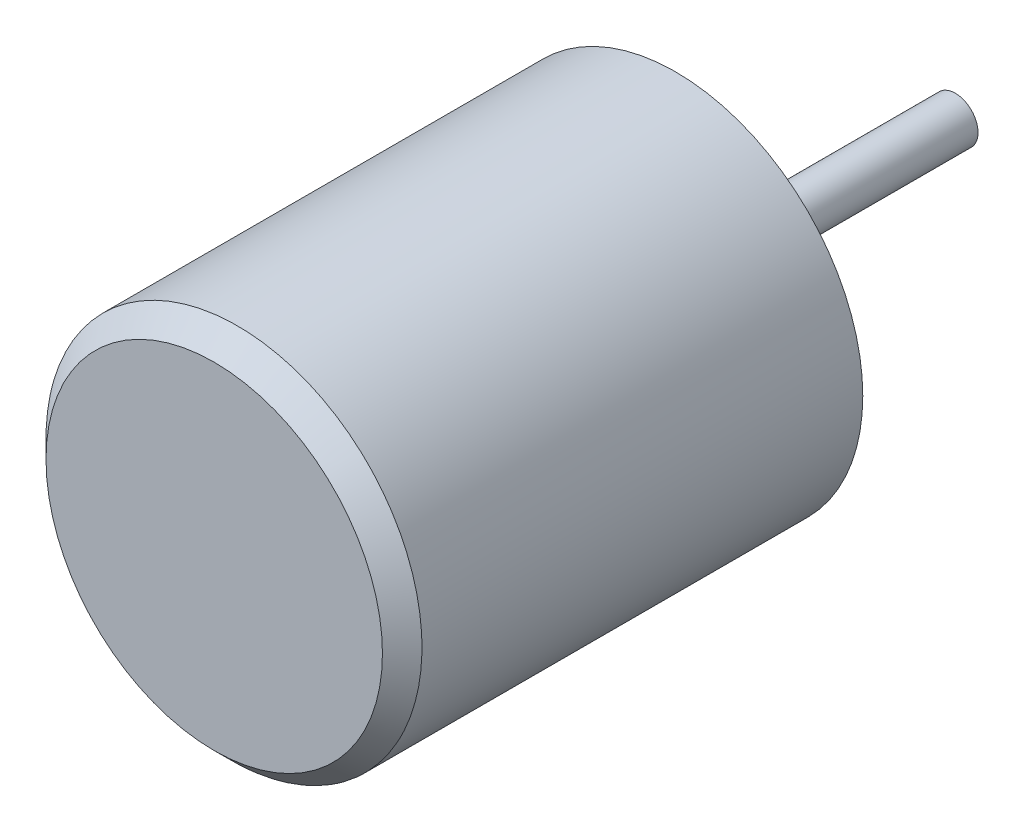
ISO-10303-21;
HEADER;
FILE_DESCRIPTION(('STEP AP214'),'2;1');
FILE_NAME('part.step','',(''),(''),'','','');
FILE_SCHEMA(('AUTOMOTIVE_DESIGN { 1 0 10303 214 1 1 1 1 }'));
ENDSEC;
DATA;
#1=APPLICATION_CONTEXT('core data for automotive mechanical design processes');
#2=APPLICATION_PROTOCOL_DEFINITION('international standard','automotive_design',2000,#1);
#3=PRODUCT_CONTEXT('',#1,'mechanical');
#4=PRODUCT('Part','Part','',(#3));
#5=PRODUCT_RELATED_PRODUCT_CATEGORY('part','',(#4));
#6=PRODUCT_DEFINITION_FORMATION('','',#4);
#7=PRODUCT_DEFINITION_CONTEXT('part definition',#1,'design');
#8=PRODUCT_DEFINITION('design','',#6,#7);
#9=PRODUCT_DEFINITION_SHAPE('','',#8);
#10=(LENGTH_UNIT() NAMED_UNIT(*) SI_UNIT(.MILLI.,.METRE.));
#11=(NAMED_UNIT(*) PLANE_ANGLE_UNIT() SI_UNIT($,.RADIAN.));
#12=(NAMED_UNIT(*) SI_UNIT($,.STERADIAN.) SOLID_ANGLE_UNIT());
#13=UNCERTAINTY_MEASURE_WITH_UNIT(LENGTH_MEASURE(1.E-05),#10,'distance_accuracy_value','');
#14=(GEOMETRIC_REPRESENTATION_CONTEXT(3) GLOBAL_UNCERTAINTY_ASSIGNED_CONTEXT((#13)) GLOBAL_UNIT_ASSIGNED_CONTEXT((#10,
#11,#12)) REPRESENTATION_CONTEXT('',''));
#15=CARTESIAN_POINT('',(0.,0.,0.));
#16=DIRECTION('',(0.,0.,1.));
#17=DIRECTION('',(1.,0.,0.));
#18=AXIS2_PLACEMENT_3D('',#15,#16,#17);
#19=CARTESIAN_POINT('',(0.534473121814927,0.133618280453732,30.));
#20=DIRECTION('',(0.,0.,-1.));
#21=DIRECTION('',(-1.,0.,0.));
#22=AXIS2_PLACEMENT_3D('',#19,#20,#21);
#23=CYLINDRICAL_SURFACE('',#22,13.);
#24=CARTESIAN_POINT('',(0.534473121814927,0.133618280453732,0.));
#25=DIRECTION('',(0.,0.,1.));
#26=DIRECTION('',(1.,0.,0.));
#27=AXIS2_PLACEMENT_3D('',#24,#25,#26);
#28=CIRCLE('',#27,13.);
#29=CARTESIAN_POINT('',(13.5344731218149,0.133618280453732,0.));
#30=VERTEX_POINT('',#29);
#31=EDGE_CURVE('E51',#30,#30,#28,.T.);
#32=ORIENTED_EDGE('',*,*,#31,.T.);
#33=EDGE_LOOP('',(#32));
#34=FACE_BOUND('',#33,.T.);
#35=CARTESIAN_POINT('',(-10.5815891085223,-6.60679420627666,30.8320856470706));
#36=CARTESIAN_POINT('',(-10.7465953752408,-6.33468358020678,30.8289303536375));
#37=CARTESIAN_POINT('',(-10.901554808995,-6.05658063778494,30.8256444419207));
#38=CARTESIAN_POINT('',(-11.1906861661973,-5.48970922692211,30.8188277364122));
#39=CARTESIAN_POINT('',(-11.3248571299788,-5.20094026686297,30.8152969313264));
#40=CARTESIAN_POINT('',(-11.5717278668296,-4.6141499094582,30.8080081753259));
#41=CARTESIAN_POINT('',(-11.684413159982,-4.31612242869088,30.8042500734594));
#42=CARTESIAN_POINT('',(-11.8876043286605,-3.71259823939278,30.7965296232786));
#43=CARTESIAN_POINT('',(-11.9781094332477,-3.40710127164329,30.7925672678707));
#44=CARTESIAN_POINT('',(-12.1481327056435,-2.74474951768837,30.7838616759656));
#45=CARTESIAN_POINT('',(-12.2240597891954,-2.38696742312381,30.779089480533));
#46=CARTESIAN_POINT('',(-12.3455118915638,-1.66625879732987,30.7693392766566));
#47=CARTESIAN_POINT('',(-12.3910339000323,-1.30333176034133,30.7643612478853));
#48=CARTESIAN_POINT('',(-12.4513529824454,-0.574849034876941,30.75423450303));
#49=CARTESIAN_POINT('',(-12.4661430523659,-0.209292766225559,30.7490857483078));
#50=CARTESIAN_POINT('',(-12.4648713713567,0.521754277082362,30.7386559612675));
#51=CARTESIAN_POINT('',(-12.4488103822197,0.887245053133214,30.7333749322188));
#52=CARTESIAN_POINT('',(-12.385953140031,1.61557205095088,30.7227184345598));
#53=CARTESIAN_POINT('',(-12.3391569565193,1.97840827872187,30.7173429661632));
#54=CARTESIAN_POINT('',(-12.2151618815213,2.69884943343407,30.7065360461986));
#55=CARTESIAN_POINT('',(-12.1379628092598,3.05645432925674,30.7011045942978));
#56=CARTESIAN_POINT('',(-11.9537165720659,3.7638668611465,30.6902248207784));
#57=CARTESIAN_POINT('',(-11.8466712268653,4.11367497118105,30.6847765002082));
#58=CARTESIAN_POINT('',(-11.6034915307796,4.80302942211979,30.6739013873947));
#59=CARTESIAN_POINT('',(-11.4673572204519,5.14257577733071,30.6684745951213));
#60=CARTESIAN_POINT('',(-11.1669563771359,5.80901724058385,30.6576805704588));
#61=CARTESIAN_POINT('',(-11.0026878488277,6.1359114493,30.6523133423229));
#62=CARTESIAN_POINT('',(-10.6471927697114,6.77469910776818,30.6416767019618));
#63=CARTESIAN_POINT('',(-10.4559662085757,7.08659255177337,30.6364072897742));
#64=CARTESIAN_POINT('',(-10.0479120973186,7.69316415401118,30.6260032694207));
#65=CARTESIAN_POINT('',(-9.83108427239093,7.98784212740072,30.6208686627026));
#66=CARTESIAN_POINT('',(-9.37337049941709,8.55788365294116,30.610770281411));
#67=CARTESIAN_POINT('',(-9.13248455373844,8.83324720699276,30.6058065068207));
#68=CARTESIAN_POINT('',(-8.62837435790649,9.36269365217639,30.5960845898867));
#69=CARTESIAN_POINT('',(-8.36515077739909,9.61677718079551,30.5913264413852));
#70=CARTESIAN_POINT('',(-7.81823013685545,10.1018656952688,30.5820487285388));
#71=CARTESIAN_POINT('',(-7.53453307676831,10.3328706810657,30.5775291641944));
#72=CARTESIAN_POINT('',(-6.94868265156055,10.7701585932943,30.5687599801608));
#73=CARTESIAN_POINT('',(-6.64652931440576,10.9764415571846,30.5645103600625));
#74=CARTESIAN_POINT('',(-6.02591405174989,11.3628182818929,30.5563104535578));
#75=CARTESIAN_POINT('',(-5.70745212734179,11.542912044466,30.5523601671314));
#76=CARTESIAN_POINT('',(-5.05651113824098,11.8756150322576,30.5447864972274));
#77=CARTESIAN_POINT('',(-4.72403324680742,12.0282265523648,30.541163086467));
#78=CARTESIAN_POINT('',(-4.04739916824677,12.3048976475581,30.5342677289511));
#79=CARTESIAN_POINT('',(-3.70324298165772,12.4289572239597,30.5309957821794));
#80=CARTESIAN_POINT('',(-3.00569946610107,12.64764143081,30.5248258183085));
#81=CARTESIAN_POINT('',(-2.65231214245083,12.7422660782135,30.5219278009939));
#82=CARTESIAN_POINT('',(-1.93881897044052,12.9014068818064,30.516525551248));
#83=CARTESIAN_POINT('',(-1.57871312254601,12.9659230400823,30.5140213187893));
#84=CARTESIAN_POINT('',(-0.854382120600759,13.0643821545574,30.5094240121448));
#85=CARTESIAN_POINT('',(-0.49015740756088,13.0983283531093,30.5073308943732));
#86=CARTESIAN_POINT('',(0.239859198769055,13.1354172930556,30.5035697792813));
#87=CARTESIAN_POINT('',(0.605651091951565,13.1385600365638,30.5019017819318));
#88=CARTESIAN_POINT('',(1.33620100326242,13.1140192269957,30.4990022847709));
#89=CARTESIAN_POINT('',(1.70095902164578,13.0863356815236,30.4977707848517));
#90=CARTESIAN_POINT('',(2.42684754630479,13.0003387802425,30.4957526739071));
#91=CARTESIAN_POINT('',(2.78797805273465,12.9420254257355,30.4949660628627));
#92=CARTESIAN_POINT('',(3.50401399266102,12.79518939495,30.4938431327901));
#93=CARTESIAN_POINT('',(3.85891993740394,12.7066692120032,30.4935067766083));
#94=CARTESIAN_POINT('',(4.5600140117958,12.5000477109321,30.4932865249205));
#95=CARTESIAN_POINT('',(4.90620214198261,12.3819463946327,30.4934026293867));
#96=CARTESIAN_POINT('',(5.5873991853424,12.1170023747296,30.4940865086489));
#97=CARTESIAN_POINT('',(5.92240810176711,11.9701596794859,30.4946542833136));
#98=CARTESIAN_POINT('',(6.57886507368483,11.6487770534419,30.4962376376914));
#99=CARTESIAN_POINT('',(6.90031312915557,11.4742371225961,30.4972532174052));
#100=CARTESIAN_POINT('',(7.52735556972826,11.0987057567307,30.4997252349683));
#101=CARTESIAN_POINT('',(7.83295033749775,10.8977149605982,30.5011816621704));
#102=CARTESIAN_POINT('',(8.4261222744043,10.4707078445924,30.5045254563813));
#103=CARTESIAN_POINT('',(8.71369944405321,10.2446915254301,30.5064128233779));
#104=CARTESIAN_POINT('',(9.26879220361965,9.7692405024505,30.5106056196547));
#105=CARTESIAN_POINT('',(9.5363077918787,9.51980579669728,30.5129110489696));
#106=CARTESIAN_POINT('',(10.04937615249,8.99929162610691,30.5179242186622));
#107=CARTESIAN_POINT('',(10.29492892385,8.72821216029194,30.520631959058));
#108=CARTESIAN_POINT('',(10.7623370616501,8.16632345659634,30.5264313497543));
#109=CARTESIAN_POINT('',(10.9841913801855,7.87551334718968,30.5295230170182));
#110=CARTESIAN_POINT('',(11.4026137417634,7.27624177644174,30.5360689692418));
#111=CARTESIAN_POINT('',(11.5991817843865,6.96778031480762,30.5395232542075));
#112=CARTESIAN_POINT('',(11.9656351178761,6.33539899336853,30.5467707090483));
#113=CARTESIAN_POINT('',(12.1355203997933,6.01147912837897,30.5505638790372));
#114=CARTESIAN_POINT('',(12.4474013829857,5.35048385296337,30.5584629794542));
#115=CARTESIAN_POINT('',(12.5893970823126,5.01340844161835,30.5625689099042));
#116=CARTESIAN_POINT('',(12.8445024634978,4.32846588526876,30.5710655812783));
#117=CARTESIAN_POINT('',(12.9576094245565,3.98059772723917,30.5754563489802));
#118=CARTESIAN_POINT('',(13.1541166363146,3.27657295533032,30.5844919412202));
#119=CARTESIAN_POINT('',(13.2375168853858,2.92041634099681,30.5891367657722));
#120=CARTESIAN_POINT('',(13.3740186300802,2.20234627691868,30.5986482112971));
#121=CARTESIAN_POINT('',(13.4271201144627,1.84043282503834,30.6035148323522));
#122=CARTESIAN_POINT('',(13.5026475392967,1.11342168291418,30.6134359600259));
#123=CARTESIAN_POINT('',(13.5250734777622,0.748323992464202,30.6184904666565));
#124=CARTESIAN_POINT('',(13.5390917370619,0.0175012176395763,30.6287525652009));
#125=CARTESIAN_POINT('',(13.5306808456652,-0.34822392812977,30.6339601730069));
#126=CARTESIAN_POINT('',(13.4830785590889,-1.07766385204283,30.6444914320953));
#127=CARTESIAN_POINT('',(13.4438871617514,-1.4413786300456,30.6498150833858));
#128=CARTESIAN_POINT('',(13.3350027748239,-2.16421262674988,30.6605409462889));
#129=CARTESIAN_POINT('',(13.2653097663096,-2.52333184259997,30.66594315795));
#130=CARTESIAN_POINT('',(13.0959177718964,-3.23442179698552,30.6767879594513));
#131=CARTESIAN_POINT('',(12.9962187850324,-3.58639253529105,30.6822305492926));
#132=CARTESIAN_POINT('',(12.7675156208305,-4.28070785422853,30.693117878652));
#133=CARTESIAN_POINT('',(12.6385094037343,-4.62305176297672,30.6985626182932));
#134=CARTESIAN_POINT('',(12.352112730326,-5.29565407695422,30.7094150940692));
#135=CARTESIAN_POINT('',(12.1947222724547,-5.62591248151961,30.7148228302019));
#136=CARTESIAN_POINT('',(11.8526759431537,-6.27199563289323,30.7255626394592));
#137=CARTESIAN_POINT('',(11.6680200847984,-6.58782038662261,30.73089471262));
#138=CARTESIAN_POINT('',(11.2727553903829,-7.20279089863228,30.7414449385419));
#139=CARTESIAN_POINT('',(11.0621465547632,-7.50193665719569,30.746663091305));
#140=CARTESIAN_POINT('',(10.6164721311445,-8.08142304266934,30.7569479105903));
#141=CARTESIAN_POINT('',(10.3814064643463,-8.36176360898489,30.7620145766244));
#142=CARTESIAN_POINT('',(9.88848976374427,-8.90164498920656,30.7719597792608));
#143=CARTESIAN_POINT('',(9.63063872956263,-9.16118580276774,30.77683831586));
#144=CARTESIAN_POINT('',(9.09398392848229,-9.65762202350643,30.7863718719517));
#145=CARTESIAN_POINT('',(8.8151801428183,-9.89451741040227,30.791026891244));
#146=CARTESIAN_POINT('',(8.23860198855156,-10.3439774626582,30.8000795210258));
#147=CARTESIAN_POINT('',(7.94082762104859,-10.5565421294288,30.8044771315301));
#148=CARTESIAN_POINT('',(7.32844572535207,-10.9558152033733,30.8129825411502));
#149=CARTESIAN_POINT('',(7.0138393227337,-11.1425253364774,30.8170903596022));
#150=CARTESIAN_POINT('',(6.37001165902961,-11.4887778222282,30.8249864167338));
#151=CARTESIAN_POINT('',(6.04079039839521,-11.6483201757139,30.8287746554234));
#152=CARTESIAN_POINT('',(5.37007335049009,-11.9391019763951,30.8360037252788));
#153=CARTESIAN_POINT('',(5.02857755230903,-12.0703413984325,30.8394445561359));
#154=CARTESIAN_POINT('',(4.3357398504434,-12.3035830793043,30.8459534599966));
#155=CARTESIAN_POINT('',(3.9843979476124,-12.4055853406733,30.8490215330326));
#156=CARTESIAN_POINT('',(3.27440037564154,-12.5796182029634,30.8547619916411));
#157=CARTESIAN_POINT('',(2.91574540924139,-12.6516516695928,30.857434415031));
#158=CARTESIAN_POINT('',(2.19363918951791,-12.7652480777037,30.862364153057));
#159=CARTESIAN_POINT('',(1.83018793591215,-12.8068110173909,30.8646214676686));
#160=CARTESIAN_POINT('',(1.10108232315328,-12.8591695237429,30.8687042072069));
#161=CARTESIAN_POINT('',(0.735428016998026,-12.8699658276088,30.870529642481));
#162=CARTESIAN_POINT('',(0.00450800101790811,-12.8607158410544,30.8737351414164));
#163=CARTESIAN_POINT('',(-0.360757709082939,-12.840669572553,30.8751152053944));
#164=CARTESIAN_POINT('',(-1.08824346960082,-12.7698824270419,30.877419517099));
#165=CARTESIAN_POINT('',(-1.45046401073134,-12.7191465954999,30.8783438397057));
#166=CARTESIAN_POINT('',(-2.169346108102,-12.5873448427222,30.8797301367276));
#167=CARTESIAN_POINT('',(-2.52600765043977,-12.5062788456471,30.8801921099868));
#168=CARTESIAN_POINT('',(-3.23128934316058,-12.3143781532722,30.8806503013639));
#169=CARTESIAN_POINT('',(-3.57990825413011,-12.2035389025898,30.8806464481688));
#170=CARTESIAN_POINT('',(-4.26656520383138,-11.9528870698836,30.8801728425925));
#171=CARTESIAN_POINT('',(-4.60460335383104,-11.8130747926597,30.8797030951125));
#172=CARTESIAN_POINT('',(-5.26777889473643,-11.5054328753528,30.878301027038));
#173=CARTESIAN_POINT('',(-5.59291318319815,-11.3375965474196,30.8773685959205));
#174=CARTESIAN_POINT('',(-6.22788221127948,-10.9751261587526,30.8750480722362));
#175=CARTESIAN_POINT('',(-6.53771683895931,-10.7804919019914,30.873659976336));
#176=CARTESIAN_POINT('',(-7.139697796118,-10.365931684841,30.8704393422892));
#177=CARTESIAN_POINT('',(-7.43185526604051,-10.1460219123516,30.8686070877826));
#178=CARTESIAN_POINT('',(-7.99653444848884,-9.68246013202398,30.8645121172937));
#179=CARTESIAN_POINT('',(-8.26905961287154,-9.43881231574479,30.8622494772403));
#180=CARTESIAN_POINT('',(-8.92536638167415,-8.80025597951241,30.8560570002026));
#181=CARTESIAN_POINT('',(-9.2955760545313,-8.39124514817025,30.8518632252466));
#182=CARTESIAN_POINT('',(-9.98105005539269,-7.5297141651727,30.8426047781389));
#183=CARTESIAN_POINT('',(-10.296332644639,-7.07720855187357,30.8375403965486));
#184=CARTESIAN_POINT('',(-10.5815891085223,-6.60679420627666,30.8320856470706));
#185=B_SPLINE_CURVE_WITH_KNOTS('',3,(#35,#36,#37,#38,#39,#40,#41,#42,#43,#44,#45,#46,#47,#48,
#49,#50,#51,#52,#53,#54,#55,#56,#57,#58,#59,#60,#61,#62,#63,#64,#65,#66,#67,#68,#69,#70,#71,#72,
#73,#74,#75,#76,#77,#78,#79,#80,#81,#82,#83,#84,#85,#86,#87,#88,#89,#90,#91,#92,#93,#94,#95,#96,
#97,#98,#99,#100,#101,#102,#103,#104,#105,#106,#107,#108,#109,#110,#111,#112,#113,#114,#115,
#116,#117,#118,#119,#120,#121,#122,#123,#124,#125,#126,#127,#128,#129,#130,#131,#132,#133,#134,
#135,#136,#137,#138,#139,#140,#141,#142,#143,#144,#145,#146,#147,#148,#149,#150,#151,#152,#153,
#154,#155,#156,#157,#158,#159,#160,#161,#162,#163,#164,#165,#166,#167,#168,#169,#170,#171,#172,
#173,#174,#175,#176,#177,#178,#179,#180,#181,#182,#183,#184),.UNSPECIFIED.,.T.,.F.,(4,2,2,2,2,2,
2,2,2,2,2,2,2,2,2,2,2,2,2,2,2,2,2,2,2,2,2,2,2,2,2,2,2,2,2,2,2,2,2,2,2,2,2,2,2,2,2,2,2,2,2,2,2,2,
2,2,2,2,2,2,2,2,2,2,2,2,2,2,2,2,2,2,2,2,4),(0.,0.954381225173299,1.90880649471903,
2.86387272753322,3.81897215183714,4.9149857243174,6.01110779491865,7.10747965203322,
8.20382443723133,9.30016674190138,10.3965155655053,11.4927975591633,12.5890780243368,
13.6854362715445,14.7817949387676,15.8781653754668,16.9745357042726,18.0708731772854,
19.167210653023,20.2635464675798,21.3598822086624,22.456126358372,23.5523704575751,
24.6486139253288,25.7448573171161,26.8409844239473,27.9371114555605,29.0332382167768,
30.1293649313968,31.2254011914115,32.3214373838017,33.4174732573827,34.5135091327654,
35.6095185396525,36.7055279154032,37.8015373817602,38.8975468976302,39.9936048571039,
41.0896628347613,42.1857211800269,43.2817796018568,44.3779412146459,45.474102887511,
46.5702649670467,47.6664271175474,48.7627034570245,49.8589798733588,50.9552569698685,
52.0515341016396,53.1478875567547,54.2442410720984,55.3405940617192,56.4369470327298,
57.5333035362738,58.6296600579994,59.7260175616337,60.8223750017082,61.9186592186652,
63.014943401768,64.1112285593381,65.2075136218714,66.3036938301523,67.3998741029839,
68.4960281099574,69.5921813379224,70.6881544035559,71.7841302096408,72.8802737983797,
73.9764058561326,75.0727998771544,76.1692019187409,77.2649056334429,78.360416223061,
80.0108634062226,81.6607608246886),.UNSPECIFIED.);
#186=CARTESIAN_POINT('',(-10.5815891085223,-6.60679420627666,30.8320856470706));
#187=VERTEX_POINT('',#186);
#188=EDGE_CURVE('E39',#187,#187,#185,.F.);
#189=ORIENTED_EDGE('',*,*,#188,.F.);
#190=EDGE_LOOP('',(#189));
#191=FACE_BOUND('',#190,.T.);
#192=ADVANCED_FACE('F35',(#34,#191),#23,.T.);
#193=CARTESIAN_POINT('',(0.534473121814927,0.133618280453732,0.));
#194=DIRECTION('',(0.,0.,1.));
#195=DIRECTION('',(1.,0.,0.));
#196=AXIS2_PLACEMENT_3D('',#193,#194,#195);
#197=PLANE('',#196);
#198=CARTESIAN_POINT('',(-0.0354915378194317,-0.0141578855492224,0.));
#199=DIRECTION('',(0.,0.,-1.));
#200=DIRECTION('',(-1.,0.,0.));
#201=AXIS2_PLACEMENT_3D('',#198,#199,#200);
#202=CIRCLE('',#201,1.57750770368115);
#203=CARTESIAN_POINT('',(-1.61299924150058,-0.0141578855492224,0.));
#204=VERTEX_POINT('',#203);
#205=EDGE_CURVE('E10',#204,#204,#202,.T.);
#206=ORIENTED_EDGE('',*,*,#205,.F.);
#207=EDGE_LOOP('',(#206));
#208=FACE_BOUND('',#207,.T.);
#209=ORIENTED_EDGE('',*,*,#31,.F.);
#210=EDGE_LOOP('',(#209));
#211=FACE_BOUND('',#210,.T.);
#212=ADVANCED_FACE('F62',(#208,#211),#197,.F.);
#213=CARTESIAN_POINT('',(0.475937161208972,-0.0509380583841726,32.));
#214=DIRECTION('',(0.,0.,-1.));
#215=DIRECTION('',(1.,0.,0.));
#216=AXIS2_PLACEMENT_3D('',#213,#214,#215);
#217=CONICAL_SURFACE('',#216,11.6869733182118,0.78539816339745);
#218=CARTESIAN_POINT('',(0.475937161208972,-0.0509380583841726,32.));
#219=DIRECTION('',(0.,0.,1.));
#220=DIRECTION('',(1.,0.,0.));
#221=AXIS2_PLACEMENT_3D('',#218,#219,#220);
#222=CIRCLE('',#221,11.6869733182118);
#223=CARTESIAN_POINT('',(12.1629104794207,-0.0509380583841726,32.));
#224=VERTEX_POINT('',#223);
#225=EDGE_CURVE('E55',#224,#224,#222,.T.);
#226=ORIENTED_EDGE('',*,*,#225,.F.);
#227=EDGE_LOOP('',(#226));
#228=FACE_BOUND('',#227,.T.);
#229=ORIENTED_EDGE('',*,*,#188,.T.);
#230=EDGE_LOOP('',(#229));
#231=FACE_BOUND('',#230,.T.);
#232=ADVANCED_FACE('F64',(#228,#231),#217,.T.);
#233=CARTESIAN_POINT('',(0.475937161208972,-0.0509380583841726,32.));
#234=DIRECTION('',(0.,0.,1.));
#235=DIRECTION('',(1.,0.,0.));
#236=AXIS2_PLACEMENT_3D('',#233,#234,#235);
#237=PLANE('',#236);
#238=ORIENTED_EDGE('',*,*,#225,.T.);
#239=EDGE_LOOP('',(#238));
#240=FACE_BOUND('',#239,.T.);
#241=ADVANCED_FACE('F71',(#240),#237,.T.);
#242=CARTESIAN_POINT('',(-0.0354915378194317,-0.0141578855492224,-20.));
#243=DIRECTION('',(0.,0.,1.));
#244=DIRECTION('',(1.,0.,0.));
#245=AXIS2_PLACEMENT_3D('',#242,#243,#244);
#246=CYLINDRICAL_SURFACE('',#245,1.57750770368115);
#247=CARTESIAN_POINT('',(-0.0354915378194317,-0.0141578855492224,-20.));
#248=DIRECTION('',(0.,0.,-1.));
#249=DIRECTION('',(-1.,0.,0.));
#250=AXIS2_PLACEMENT_3D('',#247,#248,#249);
#251=CIRCLE('',#250,1.57750770368115);
#252=CARTESIAN_POINT('',(-1.61299924150058,-0.0141578855492224,-20.));
#253=VERTEX_POINT('',#252);
#254=EDGE_CURVE('E54',#253,#253,#251,.T.);
#255=ORIENTED_EDGE('',*,*,#254,.F.);
#256=EDGE_LOOP('',(#255));
#257=FACE_BOUND('',#256,.T.);
#258=ORIENTED_EDGE('',*,*,#205,.T.);
#259=EDGE_LOOP('',(#258));
#260=FACE_BOUND('',#259,.T.);
#261=ADVANCED_FACE('F77',(#257,#260),#246,.T.);
#262=CARTESIAN_POINT('',(-0.0354915378194317,-0.0141578855492224,-20.));
#263=DIRECTION('',(0.,0.,-1.));
#264=DIRECTION('',(-1.,0.,0.));
#265=AXIS2_PLACEMENT_3D('',#262,#263,#264);
#266=PLANE('',#265);
#267=ORIENTED_EDGE('',*,*,#254,.T.);
#268=EDGE_LOOP('',(#267));
#269=FACE_BOUND('',#268,.T.);
#270=ADVANCED_FACE('F81',(#269),#266,.T.);
#271=CLOSED_SHELL('',(#192,#212,#232,#241,#261,#270));
#272=MANIFOLD_SOLID_BREP('B2',#271);
#273=ADVANCED_BREP_SHAPE_REPRESENTATION('',(#18,#272),#14);
#274=SHAPE_DEFINITION_REPRESENTATION(#9,#273);
ENDSEC;
END-ISO-10303-21;
